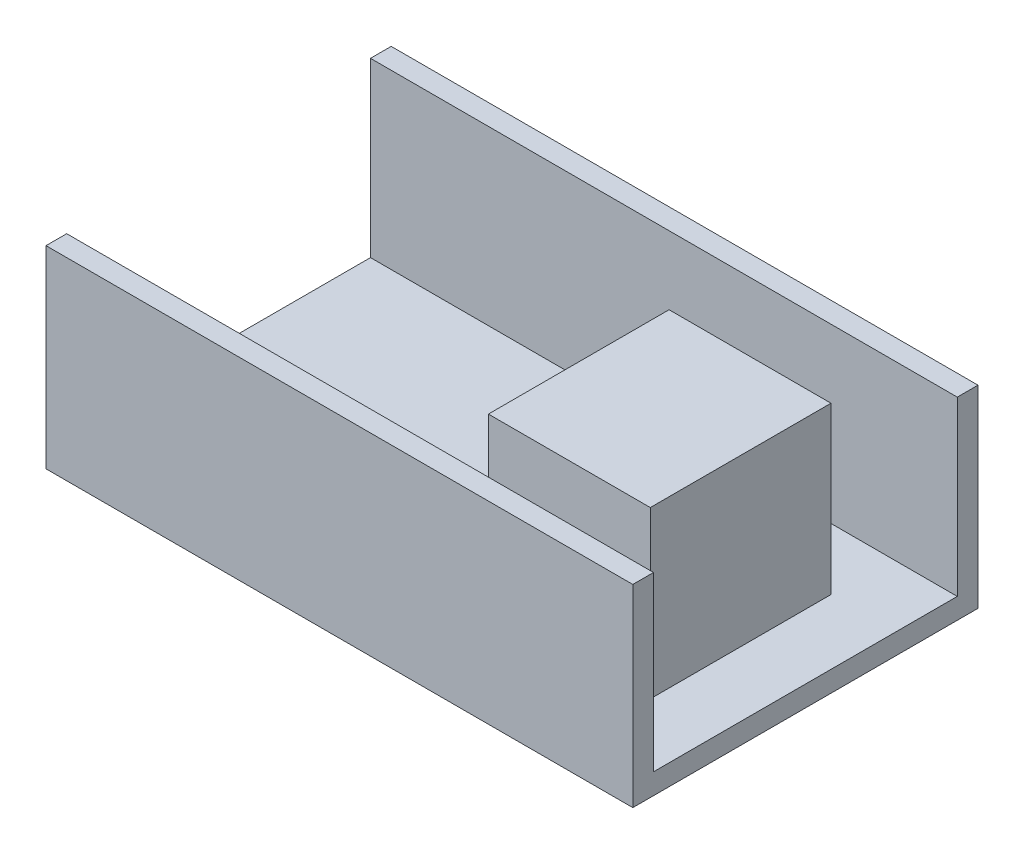
ISO-10303-21;
HEADER;
FILE_DESCRIPTION(('STEP AP214'),'2;1');
FILE_NAME('part.step','',(''),(''),'','','');
FILE_SCHEMA(('AUTOMOTIVE_DESIGN { 1 0 10303 214 1 1 1 1 }'));
ENDSEC;
DATA;
#1=APPLICATION_CONTEXT('core data for automotive mechanical design processes');
#2=APPLICATION_PROTOCOL_DEFINITION('international standard','automotive_design',2000,#1);
#3=PRODUCT_CONTEXT('',#1,'mechanical');
#4=PRODUCT('Part','Part','',(#3));
#5=PRODUCT_RELATED_PRODUCT_CATEGORY('part','',(#4));
#6=PRODUCT_DEFINITION_FORMATION('','',#4);
#7=PRODUCT_DEFINITION_CONTEXT('part definition',#1,'design');
#8=PRODUCT_DEFINITION('design','',#6,#7);
#9=PRODUCT_DEFINITION_SHAPE('','',#8);
#10=(LENGTH_UNIT() NAMED_UNIT(*) SI_UNIT(.MILLI.,.METRE.));
#11=(NAMED_UNIT(*) PLANE_ANGLE_UNIT() SI_UNIT($,.RADIAN.));
#12=(NAMED_UNIT(*) SI_UNIT($,.STERADIAN.) SOLID_ANGLE_UNIT());
#13=UNCERTAINTY_MEASURE_WITH_UNIT(LENGTH_MEASURE(1.E-05),#10,'distance_accuracy_value','');
#14=(GEOMETRIC_REPRESENTATION_CONTEXT(3) GLOBAL_UNCERTAINTY_ASSIGNED_CONTEXT((#13)) GLOBAL_UNIT_ASSIGNED_CONTEXT((#10,
#11,#12)) REPRESENTATION_CONTEXT('',''));
#15=CARTESIAN_POINT('',(0.,0.,0.));
#16=DIRECTION('',(0.,0.,1.));
#17=DIRECTION('',(1.,0.,0.));
#18=AXIS2_PLACEMENT_3D('',#15,#16,#17);
#19=CARTESIAN_POINT('',(-42.5,3.,25.));
#20=DIRECTION('',(0.,-1.,0.));
#21=DIRECTION('',(0.,0.,-1.));
#22=AXIS2_PLACEMENT_3D('',#19,#20,#21);
#23=PLANE('',#22);
#24=DIRECTION('',(0.,0.,-1.));
#25=VECTOR('',#24,1.);
#26=CARTESIAN_POINT('',(42.5,3.,25.));
#27=LINE('',#26,#25);
#28=CARTESIAN_POINT('',(42.5,3.,22.));
#29=VERTEX_POINT('',#28);
#30=CARTESIAN_POINT('',(42.5,3.,-22.));
#31=VERTEX_POINT('',#30);
#32=EDGE_CURVE('E179',#29,#31,#27,.T.);
#33=ORIENTED_EDGE('',*,*,#32,.T.);
#34=DIRECTION('',(1.,0.,0.));
#35=VECTOR('',#34,1.);
#36=CARTESIAN_POINT('',(-42.5,3.,-22.));
#37=LINE('',#36,#35);
#38=CARTESIAN_POINT('',(-42.5,3.,-22.));
#39=VERTEX_POINT('',#38);
#40=EDGE_CURVE('E199',#39,#31,#37,.T.);
#41=ORIENTED_EDGE('',*,*,#40,.F.);
#42=DIRECTION('',(0.,0.,-1.));
#43=VECTOR('',#42,1.);
#44=CARTESIAN_POINT('',(-42.5,3.,25.));
#45=LINE('',#44,#43);
#46=CARTESIAN_POINT('',(-42.5,3.,22.));
#47=VERTEX_POINT('',#46);
#48=EDGE_CURVE('E163',#47,#39,#45,.T.);
#49=ORIENTED_EDGE('',*,*,#48,.F.);
#50=DIRECTION('',(1.,0.,0.));
#51=VECTOR('',#50,1.);
#52=CARTESIAN_POINT('',(-42.5,3.,22.));
#53=LINE('',#52,#51);
#54=EDGE_CURVE('E196',#47,#29,#53,.T.);
#55=ORIENTED_EDGE('',*,*,#54,.T.);
#56=EDGE_LOOP('',(#33,#41,#49,#55));
#57=FACE_BOUND('',#56,.T.);
#58=DIRECTION('',(0.,0.,-1.));
#59=VECTOR('',#58,1.);
#60=CARTESIAN_POINT('',(33.1194902485138,3.,13.0868798717687));
#61=LINE('',#60,#59);
#62=CARTESIAN_POINT('',(33.1194902485138,3.,13.0868798717687));
#63=VERTEX_POINT('',#62);
#64=CARTESIAN_POINT('',(33.1194902485138,3.,-13.0868798717687));
#65=VERTEX_POINT('',#64);
#66=EDGE_CURVE('E145',#63,#65,#61,.T.);
#67=ORIENTED_EDGE('',*,*,#66,.F.);
#68=DIRECTION('',(1.,0.,0.));
#69=VECTOR('',#68,1.);
#70=CARTESIAN_POINT('',(9.6671611816744,3.,13.0868798717687));
#71=LINE('',#70,#69);
#72=CARTESIAN_POINT('',(9.6671611816744,3.,13.0868798717687));
#73=VERTEX_POINT('',#72);
#74=EDGE_CURVE('E142',#73,#63,#71,.T.);
#75=ORIENTED_EDGE('',*,*,#74,.F.);
#76=DIRECTION('',(0.,0.,1.));
#77=VECTOR('',#76,1.);
#78=CARTESIAN_POINT('',(9.6671611816744,3.,13.0868798717687));
#79=LINE('',#78,#77);
#80=CARTESIAN_POINT('',(9.6671611816744,3.,-13.0868798717687));
#81=VERTEX_POINT('',#80);
#82=EDGE_CURVE('E57',#81,#73,#79,.T.);
#83=ORIENTED_EDGE('',*,*,#82,.F.);
#84=DIRECTION('',(-1.,0.,0.));
#85=VECTOR('',#84,1.);
#86=CARTESIAN_POINT('',(9.6671611816744,3.,-13.0868798717687));
#87=LINE('',#86,#85);
#88=EDGE_CURVE('E52',#65,#81,#87,.T.);
#89=ORIENTED_EDGE('',*,*,#88,.F.);
#90=EDGE_LOOP('',(#67,#75,#83,#89));
#91=FACE_BOUND('',#90,.T.);
#92=ADVANCED_FACE('F35',(#57,#91),#23,.F.);
#93=CARTESIAN_POINT('',(-42.5,28.,-25.));
#94=DIRECTION('',(0.,0.,-1.));
#95=DIRECTION('',(-1.,0.,0.));
#96=AXIS2_PLACEMENT_3D('',#93,#94,#95);
#97=PLANE('',#96);
#98=DIRECTION('',(0.,1.,0.));
#99=VECTOR('',#98,1.);
#100=CARTESIAN_POINT('',(42.5,28.,-25.));
#101=LINE('',#100,#99);
#102=CARTESIAN_POINT('',(42.5,0.,-25.));
#103=VERTEX_POINT('',#102);
#104=CARTESIAN_POINT('',(42.5,28.,-25.));
#105=VERTEX_POINT('',#104);
#106=EDGE_CURVE('E146',#103,#105,#101,.T.);
#107=ORIENTED_EDGE('',*,*,#106,.F.);
#108=DIRECTION('',(1.,0.,0.));
#109=VECTOR('',#108,1.);
#110=CARTESIAN_POINT('',(-42.5,0.,-25.));
#111=LINE('',#110,#109);
#112=CARTESIAN_POINT('',(-42.5,0.,-25.));
#113=VERTEX_POINT('',#112);
#114=EDGE_CURVE('E11',#113,#103,#111,.T.);
#115=ORIENTED_EDGE('',*,*,#114,.F.);
#116=DIRECTION('',(0.,1.,0.));
#117=VECTOR('',#116,1.);
#118=CARTESIAN_POINT('',(-42.5,28.,-25.));
#119=LINE('',#118,#117);
#120=CARTESIAN_POINT('',(-42.5,28.,-25.));
#121=VERTEX_POINT('',#120);
#122=EDGE_CURVE('E155',#113,#121,#119,.T.);
#123=ORIENTED_EDGE('',*,*,#122,.T.);
#124=DIRECTION('',(1.,0.,0.));
#125=VECTOR('',#124,1.);
#126=CARTESIAN_POINT('',(-42.5,28.,-25.));
#127=LINE('',#126,#125);
#128=EDGE_CURVE('E39',#121,#105,#127,.T.);
#129=ORIENTED_EDGE('',*,*,#128,.T.);
#130=EDGE_LOOP('',(#107,#115,#123,#129));
#131=FACE_BOUND('',#130,.T.);
#132=ADVANCED_FACE('F37',(#131),#97,.T.);
#133=CARTESIAN_POINT('',(-42.5,0.,25.));
#134=DIRECTION('',(0.,-1.,0.));
#135=DIRECTION('',(0.,0.,-1.));
#136=AXIS2_PLACEMENT_3D('',#133,#134,#135);
#137=PLANE('',#136);
#138=DIRECTION('',(0.,0.,-1.));
#139=VECTOR('',#138,1.);
#140=CARTESIAN_POINT('',(42.5,0.,25.));
#141=LINE('',#140,#139);
#142=CARTESIAN_POINT('',(42.5,0.,25.));
#143=VERTEX_POINT('',#142);
#144=EDGE_CURVE('E159',#143,#103,#141,.T.);
#145=ORIENTED_EDGE('',*,*,#144,.F.);
#146=DIRECTION('',(1.,0.,0.));
#147=VECTOR('',#146,1.);
#148=CARTESIAN_POINT('',(-42.5,0.,25.));
#149=LINE('',#148,#147);
#150=CARTESIAN_POINT('',(-42.5,0.,25.));
#151=VERTEX_POINT('',#150);
#152=EDGE_CURVE('E44',#151,#143,#149,.T.);
#153=ORIENTED_EDGE('',*,*,#152,.F.);
#154=DIRECTION('',(0.,0.,-1.));
#155=VECTOR('',#154,1.);
#156=CARTESIAN_POINT('',(-42.5,0.,25.));
#157=LINE('',#156,#155);
#158=EDGE_CURVE('E172',#151,#113,#157,.T.);
#159=ORIENTED_EDGE('',*,*,#158,.T.);
#160=ORIENTED_EDGE('',*,*,#114,.T.);
#161=EDGE_LOOP('',(#145,#153,#159,#160));
#162=FACE_BOUND('',#161,.T.);
#163=ADVANCED_FACE('F219',(#162),#137,.T.);
#164=CARTESIAN_POINT('',(-42.5,28.,25.));
#165=DIRECTION('',(0.,0.,1.));
#166=DIRECTION('',(1.,0.,0.));
#167=AXIS2_PLACEMENT_3D('',#164,#165,#166);
#168=PLANE('',#167);
#169=DIRECTION('',(0.,-1.,0.));
#170=VECTOR('',#169,1.);
#171=CARTESIAN_POINT('',(42.5,28.,25.));
#172=LINE('',#171,#170);
#173=CARTESIAN_POINT('',(42.5,28.,25.));
#174=VERTEX_POINT('',#173);
#175=EDGE_CURVE('E185',#174,#143,#172,.T.);
#176=ORIENTED_EDGE('',*,*,#175,.F.);
#177=DIRECTION('',(1.,0.,0.));
#178=VECTOR('',#177,1.);
#179=CARTESIAN_POINT('',(-42.5,28.,25.));
#180=LINE('',#179,#178);
#181=CARTESIAN_POINT('',(-42.5,28.,25.));
#182=VERTEX_POINT('',#181);
#183=EDGE_CURVE('E191',#182,#174,#180,.T.);
#184=ORIENTED_EDGE('',*,*,#183,.F.);
#185=DIRECTION('',(0.,-1.,0.));
#186=VECTOR('',#185,1.);
#187=CARTESIAN_POINT('',(-42.5,28.,25.));
#188=LINE('',#187,#186);
#189=EDGE_CURVE('E169',#182,#151,#188,.T.);
#190=ORIENTED_EDGE('',*,*,#189,.T.);
#191=ORIENTED_EDGE('',*,*,#152,.T.);
#192=EDGE_LOOP('',(#176,#184,#190,#191));
#193=FACE_BOUND('',#192,.T.);
#194=ADVANCED_FACE('F241',(#193),#168,.T.);
#195=CARTESIAN_POINT('',(-42.5,28.,25.));
#196=DIRECTION('',(0.,-1.,0.));
#197=DIRECTION('',(0.,0.,-1.));
#198=AXIS2_PLACEMENT_3D('',#195,#196,#197);
#199=PLANE('',#198);
#200=DIRECTION('',(0.,0.,-1.));
#201=VECTOR('',#200,1.);
#202=CARTESIAN_POINT('',(42.5,28.,25.));
#203=LINE('',#202,#201);
#204=CARTESIAN_POINT('',(42.5,28.,22.));
#205=VERTEX_POINT('',#204);
#206=EDGE_CURVE('E183',#174,#205,#203,.T.);
#207=ORIENTED_EDGE('',*,*,#206,.T.);
#208=DIRECTION('',(1.,0.,0.));
#209=VECTOR('',#208,1.);
#210=CARTESIAN_POINT('',(-42.5,28.,22.));
#211=LINE('',#210,#209);
#212=CARTESIAN_POINT('',(-42.5,28.,22.));
#213=VERTEX_POINT('',#212);
#214=EDGE_CURVE('E193',#213,#205,#211,.T.);
#215=ORIENTED_EDGE('',*,*,#214,.F.);
#216=DIRECTION('',(0.,0.,-1.));
#217=VECTOR('',#216,1.);
#218=CARTESIAN_POINT('',(-42.5,28.,25.));
#219=LINE('',#218,#217);
#220=EDGE_CURVE('E167',#182,#213,#219,.T.);
#221=ORIENTED_EDGE('',*,*,#220,.F.);
#222=ORIENTED_EDGE('',*,*,#183,.T.);
#223=EDGE_LOOP('',(#207,#215,#221,#222));
#224=FACE_BOUND('',#223,.T.);
#225=ADVANCED_FACE('F239',(#224),#199,.F.);
#226=CARTESIAN_POINT('',(-42.5,28.,22.));
#227=DIRECTION('',(0.,0.,1.));
#228=DIRECTION('',(1.,0.,0.));
#229=AXIS2_PLACEMENT_3D('',#226,#227,#228);
#230=PLANE('',#229);
#231=DIRECTION('',(0.,1.,0.));
#232=VECTOR('',#231,1.);
#233=CARTESIAN_POINT('',(42.5,28.,22.));
#234=LINE('',#233,#232);
#235=EDGE_CURVE('E181',#205,#29,#234,.F.);
#236=ORIENTED_EDGE('',*,*,#235,.T.);
#237=ORIENTED_EDGE('',*,*,#54,.F.);
#238=DIRECTION('',(0.,1.,0.));
#239=VECTOR('',#238,1.);
#240=CARTESIAN_POINT('',(-42.5,28.,22.));
#241=LINE('',#240,#239);
#242=EDGE_CURVE('E165',#213,#47,#241,.F.);
#243=ORIENTED_EDGE('',*,*,#242,.F.);
#244=ORIENTED_EDGE('',*,*,#214,.T.);
#245=EDGE_LOOP('',(#236,#237,#243,#244));
#246=FACE_BOUND('',#245,.T.);
#247=ADVANCED_FACE('F235',(#246),#230,.F.);
#248=CARTESIAN_POINT('',(-42.5,28.,-22.));
#249=DIRECTION('',(0.,0.,-1.));
#250=DIRECTION('',(-1.,0.,0.));
#251=AXIS2_PLACEMENT_3D('',#248,#249,#250);
#252=PLANE('',#251);
#253=DIRECTION('',(0.,1.,0.));
#254=VECTOR('',#253,1.);
#255=CARTESIAN_POINT('',(42.5,28.,-22.));
#256=LINE('',#255,#254);
#257=CARTESIAN_POINT('',(42.5,28.,-22.));
#258=VERTEX_POINT('',#257);
#259=EDGE_CURVE('E177',#31,#258,#256,.T.);
#260=ORIENTED_EDGE('',*,*,#259,.T.);
#261=DIRECTION('',(1.,0.,0.));
#262=VECTOR('',#261,1.);
#263=CARTESIAN_POINT('',(-42.5,28.,-22.));
#264=LINE('',#263,#262);
#265=CARTESIAN_POINT('',(-42.5,28.,-22.));
#266=VERTEX_POINT('',#265);
#267=EDGE_CURVE('E201',#266,#258,#264,.T.);
#268=ORIENTED_EDGE('',*,*,#267,.F.);
#269=DIRECTION('',(0.,1.,0.));
#270=VECTOR('',#269,1.);
#271=CARTESIAN_POINT('',(-42.5,28.,-22.));
#272=LINE('',#271,#270);
#273=EDGE_CURVE('E161',#39,#266,#272,.T.);
#274=ORIENTED_EDGE('',*,*,#273,.F.);
#275=ORIENTED_EDGE('',*,*,#40,.T.);
#276=EDGE_LOOP('',(#260,#268,#274,#275));
#277=FACE_BOUND('',#276,.T.);
#278=ADVANCED_FACE('F228',(#277),#252,.F.);
#279=CARTESIAN_POINT('',(-42.5,28.,-22.));
#280=DIRECTION('',(0.,-1.,0.));
#281=DIRECTION('',(0.,0.,-1.));
#282=AXIS2_PLACEMENT_3D('',#279,#280,#281);
#283=PLANE('',#282);
#284=DIRECTION('',(0.,0.,-1.));
#285=VECTOR('',#284,1.);
#286=CARTESIAN_POINT('',(42.5,28.,-22.));
#287=LINE('',#286,#285);
#288=EDGE_CURVE('E149',#258,#105,#287,.T.);
#289=ORIENTED_EDGE('',*,*,#288,.T.);
#290=ORIENTED_EDGE('',*,*,#128,.F.);
#291=DIRECTION('',(0.,0.,-1.));
#292=VECTOR('',#291,1.);
#293=CARTESIAN_POINT('',(-42.5,28.,-22.));
#294=LINE('',#293,#292);
#295=EDGE_CURVE('E158',#266,#121,#294,.T.);
#296=ORIENTED_EDGE('',*,*,#295,.F.);
#297=ORIENTED_EDGE('',*,*,#267,.T.);
#298=EDGE_LOOP('',(#289,#290,#296,#297));
#299=FACE_BOUND('',#298,.T.);
#300=ADVANCED_FACE('F211',(#299),#283,.F.);
#301=CARTESIAN_POINT('',(-42.5,0.,0.));
#302=DIRECTION('',(-1.,0.,0.));
#303=DIRECTION('',(0.,0.,1.));
#304=AXIS2_PLACEMENT_3D('',#301,#302,#303);
#305=PLANE('',#304);
#306=ORIENTED_EDGE('',*,*,#122,.F.);
#307=ORIENTED_EDGE('',*,*,#158,.F.);
#308=ORIENTED_EDGE('',*,*,#189,.F.);
#309=ORIENTED_EDGE('',*,*,#220,.T.);
#310=ORIENTED_EDGE('',*,*,#242,.T.);
#311=ORIENTED_EDGE('',*,*,#48,.T.);
#312=ORIENTED_EDGE('',*,*,#273,.T.);
#313=ORIENTED_EDGE('',*,*,#295,.T.);
#314=EDGE_LOOP('',(#306,#307,#308,#309,#310,#311,#312,#313));
#315=FACE_BOUND('',#314,.T.);
#316=ADVANCED_FACE('F222',(#315),#305,.T.);
#317=CARTESIAN_POINT('',(42.5,0.,0.));
#318=DIRECTION('',(-1.,0.,0.));
#319=DIRECTION('',(0.,0.,1.));
#320=AXIS2_PLACEMENT_3D('',#317,#318,#319);
#321=PLANE('',#320);
#322=ORIENTED_EDGE('',*,*,#106,.T.);
#323=ORIENTED_EDGE('',*,*,#288,.F.);
#324=ORIENTED_EDGE('',*,*,#259,.F.);
#325=ORIENTED_EDGE('',*,*,#32,.F.);
#326=ORIENTED_EDGE('',*,*,#235,.F.);
#327=ORIENTED_EDGE('',*,*,#206,.F.);
#328=ORIENTED_EDGE('',*,*,#175,.T.);
#329=ORIENTED_EDGE('',*,*,#144,.T.);
#330=EDGE_LOOP('',(#322,#323,#324,#325,#326,#327,#328,#329));
#331=FACE_BOUND('',#330,.T.);
#332=ADVANCED_FACE('F214',(#331),#321,.F.);
#333=CARTESIAN_POINT('',(33.1194902485138,27.,13.0868798717687));
#334=DIRECTION('',(-1.,0.,0.));
#335=DIRECTION('',(0.,0.,1.));
#336=AXIS2_PLACEMENT_3D('',#333,#334,#335);
#337=PLANE('',#336);
#338=ORIENTED_EDGE('',*,*,#66,.T.);
#339=DIRECTION('',(0.,-1.,0.));
#340=VECTOR('',#339,1.);
#341=CARTESIAN_POINT('',(33.1194902485138,27.,-13.0868798717687));
#342=LINE('',#341,#340);
#343=CARTESIAN_POINT('',(33.1194902485138,27.,-13.0868798717687));
#344=VERTEX_POINT('',#343);
#345=EDGE_CURVE('E126',#344,#65,#342,.T.);
#346=ORIENTED_EDGE('',*,*,#345,.F.);
#347=DIRECTION('',(0.,0.,-1.));
#348=VECTOR('',#347,1.);
#349=CARTESIAN_POINT('',(33.1194902485138,27.,13.0868798717687));
#350=LINE('',#349,#348);
#351=CARTESIAN_POINT('',(33.1194902485138,27.,13.0868798717687));
#352=VERTEX_POINT('',#351);
#353=EDGE_CURVE('E133',#352,#344,#350,.T.);
#354=ORIENTED_EDGE('',*,*,#353,.F.);
#355=DIRECTION('',(0.,-1.,0.));
#356=VECTOR('',#355,1.);
#357=CARTESIAN_POINT('',(33.1194902485138,27.,13.0868798717687));
#358=LINE('',#357,#356);
#359=EDGE_CURVE('E366',#352,#63,#358,.T.);
#360=ORIENTED_EDGE('',*,*,#359,.T.);
#361=EDGE_LOOP('',(#338,#346,#354,#360));
#362=FACE_BOUND('',#361,.T.);
#363=ADVANCED_FACE('F144',(#362),#337,.F.);
#364=CARTESIAN_POINT('',(9.6671611816744,27.,-13.0868798717687));
#365=DIRECTION('',(0.,0.,1.));
#366=DIRECTION('',(1.,0.,0.));
#367=AXIS2_PLACEMENT_3D('',#364,#365,#366);
#368=PLANE('',#367);
#369=ORIENTED_EDGE('',*,*,#88,.T.);
#370=DIRECTION('',(0.,-1.,0.));
#371=VECTOR('',#370,1.);
#372=CARTESIAN_POINT('',(9.6671611816744,27.,-13.0868798717687));
#373=LINE('',#372,#371);
#374=CARTESIAN_POINT('',(9.6671611816744,27.,-13.0868798717687));
#375=VERTEX_POINT('',#374);
#376=EDGE_CURVE('E129',#375,#81,#373,.T.);
#377=ORIENTED_EDGE('',*,*,#376,.F.);
#378=DIRECTION('',(-1.,0.,0.));
#379=VECTOR('',#378,1.);
#380=CARTESIAN_POINT('',(9.6671611816744,27.,-13.0868798717687));
#381=LINE('',#380,#379);
#382=EDGE_CURVE('E122',#344,#375,#381,.T.);
#383=ORIENTED_EDGE('',*,*,#382,.F.);
#384=ORIENTED_EDGE('',*,*,#345,.T.);
#385=EDGE_LOOP('',(#369,#377,#383,#384));
#386=FACE_BOUND('',#385,.T.);
#387=ADVANCED_FACE('F124',(#386),#368,.F.);
#388=CARTESIAN_POINT('',(9.6671611816744,27.,13.0868798717687));
#389=DIRECTION('',(1.,0.,0.));
#390=DIRECTION('',(0.,0.,-1.));
#391=AXIS2_PLACEMENT_3D('',#388,#389,#390);
#392=PLANE('',#391);
#393=ORIENTED_EDGE('',*,*,#82,.T.);
#394=DIRECTION('',(0.,-1.,0.));
#395=VECTOR('',#394,1.);
#396=CARTESIAN_POINT('',(9.6671611816744,27.,13.0868798717687));
#397=LINE('',#396,#395);
#398=CARTESIAN_POINT('',(9.6671611816744,27.,13.0868798717687));
#399=VERTEX_POINT('',#398);
#400=EDGE_CURVE('E151',#399,#73,#397,.T.);
#401=ORIENTED_EDGE('',*,*,#400,.F.);
#402=DIRECTION('',(0.,0.,1.));
#403=VECTOR('',#402,1.);
#404=CARTESIAN_POINT('',(9.6671611816744,27.,13.0868798717687));
#405=LINE('',#404,#403);
#406=EDGE_CURVE('E132',#375,#399,#405,.T.);
#407=ORIENTED_EDGE('',*,*,#406,.F.);
#408=ORIENTED_EDGE('',*,*,#376,.T.);
#409=EDGE_LOOP('',(#393,#401,#407,#408));
#410=FACE_BOUND('',#409,.T.);
#411=ADVANCED_FACE('F272',(#410),#392,.F.);
#412=CARTESIAN_POINT('',(9.6671611816744,27.,13.0868798717687));
#413=DIRECTION('',(0.,0.,-1.));
#414=DIRECTION('',(-1.,0.,0.));
#415=AXIS2_PLACEMENT_3D('',#412,#413,#414);
#416=PLANE('',#415);
#417=ORIENTED_EDGE('',*,*,#74,.T.);
#418=ORIENTED_EDGE('',*,*,#359,.F.);
#419=DIRECTION('',(1.,0.,0.));
#420=VECTOR('',#419,1.);
#421=CARTESIAN_POINT('',(9.6671611816744,27.,13.0868798717687));
#422=LINE('',#421,#420);
#423=EDGE_CURVE('E138',#399,#352,#422,.T.);
#424=ORIENTED_EDGE('',*,*,#423,.F.);
#425=ORIENTED_EDGE('',*,*,#400,.T.);
#426=EDGE_LOOP('',(#417,#418,#424,#425));
#427=FACE_BOUND('',#426,.T.);
#428=ADVANCED_FACE('F275',(#427),#416,.F.);
#429=CARTESIAN_POINT('',(0.,27.,0.));
#430=DIRECTION('',(0.,-1.,0.));
#431=DIRECTION('',(0.,0.,-1.));
#432=AXIS2_PLACEMENT_3D('',#429,#430,#431);
#433=PLANE('',#432);
#434=ORIENTED_EDGE('',*,*,#353,.T.);
#435=ORIENTED_EDGE('',*,*,#382,.T.);
#436=ORIENTED_EDGE('',*,*,#406,.T.);
#437=ORIENTED_EDGE('',*,*,#423,.T.);
#438=EDGE_LOOP('',(#434,#435,#436,#437));
#439=FACE_BOUND('',#438,.T.);
#440=ADVANCED_FACE('F136',(#439),#433,.F.);
#441=CLOSED_SHELL('',(#92,#132,#163,#194,#225,#247,#278,#300,#316,#332,#363,#387,#411,#428,#440));
#442=MANIFOLD_SOLID_BREP('B2',#441);
#443=ADVANCED_BREP_SHAPE_REPRESENTATION('',(#18,#442),#14);
#444=SHAPE_DEFINITION_REPRESENTATION(#9,#443);
ENDSEC;
END-ISO-10303-21;
